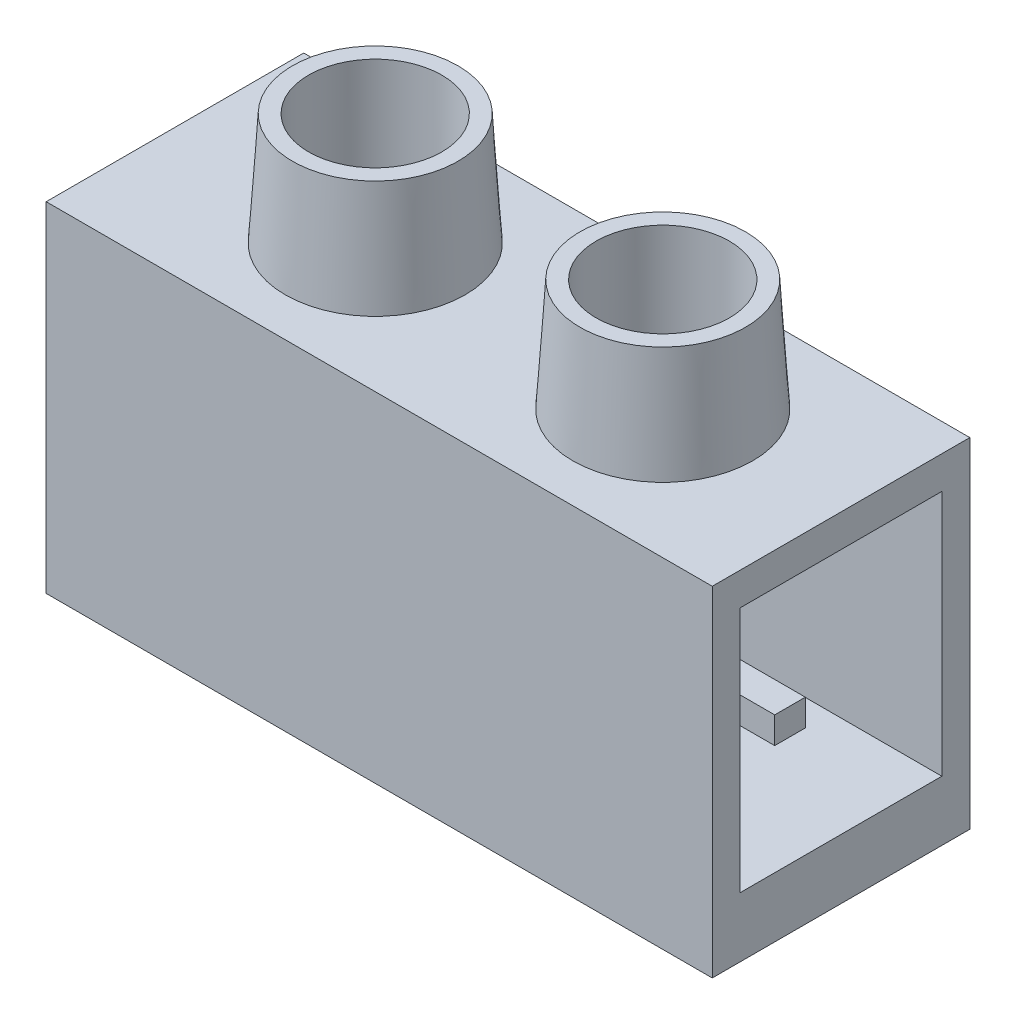
ISO-10303-21;
HEADER;
FILE_DESCRIPTION(('STEP AP214'),'2;1');
FILE_NAME('part.step','',(''),(''),'','','');
FILE_SCHEMA(('AUTOMOTIVE_DESIGN { 1 0 10303 214 1 1 1 1 }'));
ENDSEC;
DATA;
#1=APPLICATION_CONTEXT('core data for automotive mechanical design processes');
#2=APPLICATION_PROTOCOL_DEFINITION('international standard','automotive_design',2000,#1);
#3=PRODUCT_CONTEXT('',#1,'mechanical');
#4=PRODUCT('Part','Part','',(#3));
#5=PRODUCT_RELATED_PRODUCT_CATEGORY('part','',(#4));
#6=PRODUCT_DEFINITION_FORMATION('','',#4);
#7=PRODUCT_DEFINITION_CONTEXT('part definition',#1,'design');
#8=PRODUCT_DEFINITION('design','',#6,#7);
#9=PRODUCT_DEFINITION_SHAPE('','',#8);
#10=(LENGTH_UNIT() NAMED_UNIT(*) SI_UNIT(.MILLI.,.METRE.));
#11=(NAMED_UNIT(*) PLANE_ANGLE_UNIT() SI_UNIT($,.RADIAN.));
#12=(NAMED_UNIT(*) SI_UNIT($,.STERADIAN.) SOLID_ANGLE_UNIT());
#13=UNCERTAINTY_MEASURE_WITH_UNIT(LENGTH_MEASURE(1.E-05),#10,'distance_accuracy_value','');
#14=(GEOMETRIC_REPRESENTATION_CONTEXT(3) GLOBAL_UNCERTAINTY_ASSIGNED_CONTEXT((#13)) GLOBAL_UNIT_ASSIGNED_CONTEXT((#10,
#11,#12)) REPRESENTATION_CONTEXT('',''));
#15=CARTESIAN_POINT('',(0.,0.,0.));
#16=DIRECTION('',(0.,0.,1.));
#17=DIRECTION('',(1.,0.,0.));
#18=AXIS2_PLACEMENT_3D('',#15,#16,#17);
#19=CARTESIAN_POINT('',(-29.3484668170505,13.81,-4.54));
#20=DIRECTION('',(0.,1.,0.));
#21=DIRECTION('',(0.,0.,1.));
#22=AXIS2_PLACEMENT_3D('',#19,#20,#21);
#23=PLANE('',#22);
#24=DIRECTION('',(-1.,0.,0.));
#25=VECTOR('',#24,1.);
#26=CARTESIAN_POINT('',(10.0423301704278,13.81,2.97));
#27=LINE('',#26,#25);
#28=CARTESIAN_POINT('',(10.0423301704278,13.81,2.97));
#29=VERTEX_POINT('',#28);
#30=CARTESIAN_POINT('',(7.39320207938998,13.81,2.97));
#31=VERTEX_POINT('',#30);
#32=EDGE_CURVE('E265',#29,#31,#27,.T.);
#33=ORIENTED_EDGE('',*,*,#32,.T.);
#34=CARTESIAN_POINT('',(6.97,13.81,0.));
#35=DIRECTION('',(0.,1.,0.));
#36=DIRECTION('',(0.,0.,1.));
#37=AXIS2_PLACEMENT_3D('',#34,#35,#36);
#38=CIRCLE('',#37,3.);
#39=CARTESIAN_POINT('',(7.39320207938998,13.81,-2.97));
#40=VERTEX_POINT('',#39);
#41=EDGE_CURVE('E57',#40,#31,#38,.F.);
#42=ORIENTED_EDGE('',*,*,#41,.F.);
#43=DIRECTION('',(-1.,0.,0.));
#44=VECTOR('',#43,1.);
#45=CARTESIAN_POINT('',(10.0423301704278,13.81,-2.97));
#46=LINE('',#45,#44);
#47=CARTESIAN_POINT('',(10.0423301704278,13.81,-2.97));
#48=VERTEX_POINT('',#47);
#49=EDGE_CURVE('E351',#48,#40,#46,.T.);
#50=ORIENTED_EDGE('',*,*,#49,.F.);
#51=DIRECTION('',(0.,0.,-1.));
#52=VECTOR('',#51,1.);
#53=CARTESIAN_POINT('',(10.0423301704278,13.81,-4.54));
#54=LINE('',#53,#52);
#55=CARTESIAN_POINT('',(10.0423301704278,13.81,-4.54));
#56=VERTEX_POINT('',#55);
#57=EDGE_CURVE('E344',#48,#56,#54,.T.);
#58=ORIENTED_EDGE('',*,*,#57,.T.);
#59=DIRECTION('',(1.,0.,0.));
#60=VECTOR('',#59,1.);
#61=CARTESIAN_POINT('',(-29.3484668170505,13.81,-4.54));
#62=LINE('',#61,#60);
#63=CARTESIAN_POINT('',(15.,13.81,-4.54));
#64=VERTEX_POINT('',#63);
#65=EDGE_CURVE('E428',#56,#64,#62,.T.);
#66=ORIENTED_EDGE('',*,*,#65,.T.);
#67=DIRECTION('',(0.,0.,1.));
#68=VECTOR('',#67,1.);
#69=CARTESIAN_POINT('',(15.,13.81,-4.54));
#70=LINE('',#69,#68);
#71=CARTESIAN_POINT('',(15.,13.81,4.54));
#72=VERTEX_POINT('',#71);
#73=EDGE_CURVE('E423',#64,#72,#70,.T.);
#74=ORIENTED_EDGE('',*,*,#73,.T.);
#75=DIRECTION('',(1.,0.,0.));
#76=VECTOR('',#75,1.);
#77=CARTESIAN_POINT('',(-29.3484668170505,13.81,4.54));
#78=LINE('',#77,#76);
#79=CARTESIAN_POINT('',(10.0423301704278,13.81,4.54));
#80=VERTEX_POINT('',#79);
#81=EDGE_CURVE('E410',#80,#72,#78,.T.);
#82=ORIENTED_EDGE('',*,*,#81,.F.);
#83=DIRECTION('',(0.,0.,-1.));
#84=VECTOR('',#83,1.);
#85=CARTESIAN_POINT('',(10.0423301704278,13.81,4.54));
#86=LINE('',#85,#84);
#87=EDGE_CURVE('E293',#80,#29,#86,.T.);
#88=ORIENTED_EDGE('',*,*,#87,.T.);
#89=EDGE_LOOP('',(#33,#42,#50,#58,#66,#74,#82,#88));
#90=FACE_BOUND('',#89,.T.);
#91=ADVANCED_FACE('F33',(#90),#23,.F.);
#92=CARTESIAN_POINT('',(6.54679792061003,13.81,-2.97));
#93=VERTEX_POINT('',#92);
#94=CARTESIAN_POINT('',(-5.55679792061001,13.81,-2.97));
#95=VERTEX_POINT('',#94);
#96=EDGE_CURVE('E355',#93,#95,#46,.T.);
#97=ORIENTED_EDGE('',*,*,#96,.F.);
#98=CARTESIAN_POINT('',(6.54679792061003,13.81,2.97));
#99=VERTEX_POINT('',#98);
#100=EDGE_CURVE('E284',#99,#93,#38,.F.);
#101=ORIENTED_EDGE('',*,*,#100,.F.);
#102=CARTESIAN_POINT('',(-5.55679792061001,13.81,2.97));
#103=VERTEX_POINT('',#102);
#104=EDGE_CURVE('E241',#99,#103,#27,.T.);
#105=ORIENTED_EDGE('',*,*,#104,.T.);
#106=CARTESIAN_POINT('',(-5.98,13.81,0.));
#107=DIRECTION('',(0.,1.,0.));
#108=DIRECTION('',(0.,0.,1.));
#109=AXIS2_PLACEMENT_3D('',#106,#107,#108);
#110=CIRCLE('',#109,3.);
#111=EDGE_CURVE('E49',#95,#103,#110,.F.);
#112=ORIENTED_EDGE('',*,*,#111,.F.);
#113=EDGE_LOOP('',(#97,#101,#105,#112));
#114=FACE_BOUND('',#113,.T.);
#115=ADVANCED_FACE('F281',(#114),#23,.F.);
#116=CARTESIAN_POINT('',(10.0423301704278,10.81,0.75));
#117=DIRECTION('',(0.,0.,1.));
#118=DIRECTION('',(1.,0.,0.));
#119=AXIS2_PLACEMENT_3D('',#116,#117,#118);
#120=PLANE('',#119);
#121=DIRECTION('',(-1.,0.,0.));
#122=VECTOR('',#121,1.);
#123=CARTESIAN_POINT('',(10.0423301704278,10.81,0.75));
#124=LINE('',#123,#122);
#125=CARTESIAN_POINT('',(-9.67766982957222,10.81,0.75));
#126=VERTEX_POINT('',#125);
#127=CARTESIAN_POINT('',(-15.,10.81,0.75));
#128=VERTEX_POINT('',#127);
#129=EDGE_CURVE('E399',#126,#128,#124,.T.);
#130=ORIENTED_EDGE('',*,*,#129,.F.);
#131=DIRECTION('',(0.,-1.,0.));
#132=VECTOR('',#131,1.);
#133=CARTESIAN_POINT('',(-9.67766982957222,13.81,0.750000000000001));
#134=LINE('',#133,#132);
#135=CARTESIAN_POINT('',(-9.67766982957222,13.81,0.750000000000001));
#136=VERTEX_POINT('',#135);
#137=EDGE_CURVE('E682',#136,#126,#134,.T.);
#138=ORIENTED_EDGE('',*,*,#137,.F.);
#139=DIRECTION('',(-1.,0.,0.));
#140=VECTOR('',#139,1.);
#141=CARTESIAN_POINT('',(10.0423301704278,13.81,0.75));
#142=LINE('',#141,#140);
#143=CARTESIAN_POINT('',(-15.,13.81,0.750000000000001));
#144=VERTEX_POINT('',#143);
#145=EDGE_CURVE('E398',#136,#144,#142,.T.);
#146=ORIENTED_EDGE('',*,*,#145,.T.);
#147=DIRECTION('',(0.,1.,0.));
#148=VECTOR('',#147,1.);
#149=CARTESIAN_POINT('',(-15.,10.81,0.75));
#150=LINE('',#149,#148);
#151=EDGE_CURVE('E382',#128,#144,#150,.T.);
#152=ORIENTED_EDGE('',*,*,#151,.F.);
#153=EDGE_LOOP('',(#130,#138,#146,#152));
#154=FACE_BOUND('',#153,.T.);
#155=ADVANCED_FACE('F505',(#154),#120,.T.);
#156=CARTESIAN_POINT('',(10.0423301704278,10.81,-0.75));
#157=DIRECTION('',(0.,-1.,0.));
#158=DIRECTION('',(0.,0.,-1.));
#159=AXIS2_PLACEMENT_3D('',#156,#157,#158);
#160=PLANE('',#159);
#161=DIRECTION('',(-1.,0.,0.));
#162=VECTOR('',#161,1.);
#163=CARTESIAN_POINT('',(10.0423301704278,10.81,-0.75));
#164=LINE('',#163,#162);
#165=CARTESIAN_POINT('',(-9.67766982957222,10.81,-0.75));
#166=VERTEX_POINT('',#165);
#167=CARTESIAN_POINT('',(-15.,10.81,-0.75));
#168=VERTEX_POINT('',#167);
#169=EDGE_CURVE('E402',#166,#168,#164,.T.);
#170=ORIENTED_EDGE('',*,*,#169,.F.);
#171=DIRECTION('',(0.,0.,-1.));
#172=VECTOR('',#171,1.);
#173=CARTESIAN_POINT('',(-9.67766982957222,10.81,0.75));
#174=LINE('',#173,#172);
#175=EDGE_CURVE('E687',#126,#166,#174,.T.);
#176=ORIENTED_EDGE('',*,*,#175,.F.);
#177=ORIENTED_EDGE('',*,*,#129,.T.);
#178=DIRECTION('',(0.,0.,1.));
#179=VECTOR('',#178,1.);
#180=CARTESIAN_POINT('',(-15.,10.81,-0.75));
#181=LINE('',#180,#179);
#182=EDGE_CURVE('E395',#168,#128,#181,.T.);
#183=ORIENTED_EDGE('',*,*,#182,.F.);
#184=EDGE_LOOP('',(#170,#176,#177,#183));
#185=FACE_BOUND('',#184,.T.);
#186=ADVANCED_FACE('F669',(#185),#160,.T.);
#187=CARTESIAN_POINT('',(10.0423301704278,10.81,-0.75));
#188=DIRECTION('',(0.,0.,-1.));
#189=DIRECTION('',(-1.,0.,0.));
#190=AXIS2_PLACEMENT_3D('',#187,#188,#189);
#191=PLANE('',#190);
#192=DIRECTION('',(-1.,0.,0.));
#193=VECTOR('',#192,1.);
#194=CARTESIAN_POINT('',(10.0423301704278,13.81,-0.75));
#195=LINE('',#194,#193);
#196=CARTESIAN_POINT('',(-9.67766982957222,13.81,-0.75));
#197=VERTEX_POINT('',#196);
#198=CARTESIAN_POINT('',(-15.,13.81,-0.75));
#199=VERTEX_POINT('',#198);
#200=EDGE_CURVE('E404',#197,#199,#195,.T.);
#201=ORIENTED_EDGE('',*,*,#200,.F.);
#202=DIRECTION('',(0.,1.,0.));
#203=VECTOR('',#202,1.);
#204=CARTESIAN_POINT('',(-9.67766982957222,10.81,-0.75));
#205=LINE('',#204,#203);
#206=EDGE_CURVE('E302',#166,#197,#205,.T.);
#207=ORIENTED_EDGE('',*,*,#206,.F.);
#208=ORIENTED_EDGE('',*,*,#169,.T.);
#209=DIRECTION('',(0.,-1.,0.));
#210=VECTOR('',#209,1.);
#211=CARTESIAN_POINT('',(-15.,10.81,-0.75));
#212=LINE('',#211,#210);
#213=EDGE_CURVE('E392',#199,#168,#212,.T.);
#214=ORIENTED_EDGE('',*,*,#213,.F.);
#215=EDGE_LOOP('',(#201,#207,#208,#214));
#216=FACE_BOUND('',#215,.T.);
#217=ADVANCED_FACE('F498',(#216),#191,.T.);
#218=CARTESIAN_POINT('',(-15.,15.28,5.8));
#219=DIRECTION('',(1.,0.,0.));
#220=DIRECTION('',(0.,0.,-1.));
#221=AXIS2_PLACEMENT_3D('',#218,#219,#220);
#222=PLANE('',#221);
#223=DIRECTION('',(0.,0.,-1.));
#224=VECTOR('',#223,1.);
#225=CARTESIAN_POINT('',(-15.,13.81,-4.54));
#226=LINE('',#225,#224);
#227=CARTESIAN_POINT('',(-15.,13.81,2.97));
#228=VERTEX_POINT('',#227);
#229=EDGE_CURVE('E411',#228,#144,#226,.T.);
#230=ORIENTED_EDGE('',*,*,#229,.F.);
#231=DIRECTION('',(0.,-1.,0.));
#232=VECTOR('',#231,1.);
#233=CARTESIAN_POINT('',(-15.,13.81,2.97));
#234=LINE('',#233,#232);
#235=CARTESIAN_POINT('',(-15.,10.81,2.97));
#236=VERTEX_POINT('',#235);
#237=EDGE_CURVE('E263',#228,#236,#234,.T.);
#238=ORIENTED_EDGE('',*,*,#237,.T.);
#239=DIRECTION('',(0.,0.,1.));
#240=VECTOR('',#239,1.);
#241=CARTESIAN_POINT('',(-15.,10.81,4.54));
#242=LINE('',#241,#240);
#243=CARTESIAN_POINT('',(-15.,10.81,4.54));
#244=VERTEX_POINT('',#243);
#245=EDGE_CURVE('E297',#236,#244,#242,.T.);
#246=ORIENTED_EDGE('',*,*,#245,.T.);
#247=DIRECTION('',(0.,1.,0.));
#248=VECTOR('',#247,1.);
#249=CARTESIAN_POINT('',(-15.,2.7,4.54));
#250=LINE('',#249,#248);
#251=CARTESIAN_POINT('',(-15.,2.7,4.54));
#252=VERTEX_POINT('',#251);
#253=EDGE_CURVE('E413',#252,#244,#250,.T.);
#254=ORIENTED_EDGE('',*,*,#253,.F.);
#255=DIRECTION('',(0.,0.,1.));
#256=VECTOR('',#255,1.);
#257=CARTESIAN_POINT('',(-15.,2.7,-4.54));
#258=LINE('',#257,#256);
#259=CARTESIAN_POINT('',(-15.,2.7,3.35));
#260=VERTEX_POINT('',#259);
#261=EDGE_CURVE('E415',#260,#252,#258,.T.);
#262=ORIENTED_EDGE('',*,*,#261,.F.);
#263=DIRECTION('',(0.,1.,0.));
#264=VECTOR('',#263,1.);
#265=CARTESIAN_POINT('',(-15.,2.7,3.35));
#266=LINE('',#265,#264);
#267=CARTESIAN_POINT('',(-15.,3.9,3.35));
#268=VERTEX_POINT('',#267);
#269=EDGE_CURVE('E306',#260,#268,#266,.T.);
#270=ORIENTED_EDGE('',*,*,#269,.T.);
#271=DIRECTION('',(0.,0.,-1.));
#272=VECTOR('',#271,1.);
#273=CARTESIAN_POINT('',(-15.,3.9,3.35));
#274=LINE('',#273,#272);
#275=CARTESIAN_POINT('',(-15.,3.9,1.97));
#276=VERTEX_POINT('',#275);
#277=EDGE_CURVE('E310',#268,#276,#274,.T.);
#278=ORIENTED_EDGE('',*,*,#277,.T.);
#279=DIRECTION('',(0.,-1.,0.));
#280=VECTOR('',#279,1.);
#281=CARTESIAN_POINT('',(-15.,2.7,1.97));
#282=LINE('',#281,#280);
#283=CARTESIAN_POINT('',(-15.,2.7,1.97));
#284=VERTEX_POINT('',#283);
#285=EDGE_CURVE('E315',#276,#284,#282,.T.);
#286=ORIENTED_EDGE('',*,*,#285,.T.);
#287=CARTESIAN_POINT('',(-15.,2.7,-1.97));
#288=VERTEX_POINT('',#287);
#289=EDGE_CURVE('E437',#288,#284,#258,.T.);
#290=ORIENTED_EDGE('',*,*,#289,.F.);
#291=DIRECTION('',(0.,1.,0.));
#292=VECTOR('',#291,1.);
#293=CARTESIAN_POINT('',(-15.,2.7,-1.97));
#294=LINE('',#293,#292);
#295=CARTESIAN_POINT('',(-15.,3.9,-1.97));
#296=VERTEX_POINT('',#295);
#297=EDGE_CURVE('E375',#288,#296,#294,.T.);
#298=ORIENTED_EDGE('',*,*,#297,.T.);
#299=DIRECTION('',(0.,0.,-1.));
#300=VECTOR('',#299,1.);
#301=CARTESIAN_POINT('',(-15.,3.9,-3.35));
#302=LINE('',#301,#300);
#303=CARTESIAN_POINT('',(-15.,3.9,-3.35));
#304=VERTEX_POINT('',#303);
#305=EDGE_CURVE('E364',#296,#304,#302,.T.);
#306=ORIENTED_EDGE('',*,*,#305,.T.);
#307=DIRECTION('',(0.,-1.,0.));
#308=VECTOR('',#307,1.);
#309=CARTESIAN_POINT('',(-15.,2.7,-3.35));
#310=LINE('',#309,#308);
#311=CARTESIAN_POINT('',(-15.,2.7,-3.35));
#312=VERTEX_POINT('',#311);
#313=EDGE_CURVE('E354',#304,#312,#310,.T.);
#314=ORIENTED_EDGE('',*,*,#313,.T.);
#315=CARTESIAN_POINT('',(-15.,2.7,-4.54));
#316=VERTEX_POINT('',#315);
#317=EDGE_CURVE('E434',#316,#312,#258,.T.);
#318=ORIENTED_EDGE('',*,*,#317,.F.);
#319=DIRECTION('',(0.,-1.,0.));
#320=VECTOR('',#319,1.);
#321=CARTESIAN_POINT('',(-15.,2.7,-4.54));
#322=LINE('',#321,#320);
#323=CARTESIAN_POINT('',(-15.,10.81,-4.54));
#324=VERTEX_POINT('',#323);
#325=EDGE_CURVE('E407',#324,#316,#322,.T.);
#326=ORIENTED_EDGE('',*,*,#325,.F.);
#327=DIRECTION('',(0.,0.,1.));
#328=VECTOR('',#327,1.);
#329=CARTESIAN_POINT('',(-15.,10.81,-4.54));
#330=LINE('',#329,#328);
#331=CARTESIAN_POINT('',(-15.,10.81,-2.97));
#332=VERTEX_POINT('',#331);
#333=EDGE_CURVE('E327',#324,#332,#330,.T.);
#334=ORIENTED_EDGE('',*,*,#333,.T.);
#335=DIRECTION('',(0.,1.,0.));
#336=VECTOR('',#335,1.);
#337=CARTESIAN_POINT('',(-15.,13.81,-2.97));
#338=LINE('',#337,#336);
#339=CARTESIAN_POINT('',(-15.,13.81,-2.97));
#340=VERTEX_POINT('',#339);
#341=EDGE_CURVE('E338',#332,#340,#338,.T.);
#342=ORIENTED_EDGE('',*,*,#341,.T.);
#343=EDGE_CURVE('E409',#199,#340,#226,.T.);
#344=ORIENTED_EDGE('',*,*,#343,.F.);
#345=ORIENTED_EDGE('',*,*,#213,.T.);
#346=ORIENTED_EDGE('',*,*,#182,.T.);
#347=ORIENTED_EDGE('',*,*,#151,.T.);
#348=EDGE_LOOP('',(#230,#238,#246,#254,#262,#270,#278,#286,#290,#298,#306,#314,#318,#326,#334,
#342,#344,#345,#346,#347));
#349=FACE_BOUND('',#348,.T.);
#350=DIRECTION('',(0.,0.,1.));
#351=VECTOR('',#350,1.);
#352=CARTESIAN_POINT('',(-15.,0.,5.8));
#353=LINE('',#352,#351);
#354=CARTESIAN_POINT('',(-15.,0.,-5.8));
#355=VERTEX_POINT('',#354);
#356=CARTESIAN_POINT('',(-15.,0.,5.8));
#357=VERTEX_POINT('',#356);
#358=EDGE_CURVE('E443',#355,#357,#353,.T.);
#359=ORIENTED_EDGE('',*,*,#358,.T.);
#360=DIRECTION('',(0.,-1.,0.));
#361=VECTOR('',#360,1.);
#362=CARTESIAN_POINT('',(-15.,15.28,5.8));
#363=LINE('',#362,#361);
#364=CARTESIAN_POINT('',(-15.,15.28,5.8));
#365=VERTEX_POINT('',#364);
#366=EDGE_CURVE('E11',#365,#357,#363,.T.);
#367=ORIENTED_EDGE('',*,*,#366,.F.);
#368=DIRECTION('',(0.,0.,1.));
#369=VECTOR('',#368,1.);
#370=CARTESIAN_POINT('',(-15.,15.28,5.8));
#371=LINE('',#370,#369);
#372=CARTESIAN_POINT('',(-15.,15.28,-5.8));
#373=VERTEX_POINT('',#372);
#374=EDGE_CURVE('E444',#373,#365,#371,.T.);
#375=ORIENTED_EDGE('',*,*,#374,.F.);
#376=DIRECTION('',(0.,-1.,0.));
#377=VECTOR('',#376,1.);
#378=CARTESIAN_POINT('',(-15.,15.28,-5.8));
#379=LINE('',#378,#377);
#380=EDGE_CURVE('E454',#373,#355,#379,.T.);
#381=ORIENTED_EDGE('',*,*,#380,.T.);
#382=EDGE_LOOP('',(#359,#367,#375,#381));
#383=FACE_BOUND('',#382,.T.);
#384=ADVANCED_FACE('F485',(#349,#383),#222,.F.);
#385=CARTESIAN_POINT('',(15.,15.28,5.8));
#386=DIRECTION('',(0.,0.,-1.));
#387=DIRECTION('',(-1.,0.,0.));
#388=AXIS2_PLACEMENT_3D('',#385,#386,#387);
#389=PLANE('',#388);
#390=DIRECTION('',(1.,0.,0.));
#391=VECTOR('',#390,1.);
#392=CARTESIAN_POINT('',(15.,0.,5.8));
#393=LINE('',#392,#391);
#394=CARTESIAN_POINT('',(15.,0.,5.8));
#395=VERTEX_POINT('',#394);
#396=EDGE_CURVE('E457',#357,#395,#393,.T.);
#397=ORIENTED_EDGE('',*,*,#396,.T.);
#398=DIRECTION('',(0.,-1.,0.));
#399=VECTOR('',#398,1.);
#400=CARTESIAN_POINT('',(15.,15.28,5.8));
#401=LINE('',#400,#399);
#402=CARTESIAN_POINT('',(15.,15.28,5.8));
#403=VERTEX_POINT('',#402);
#404=EDGE_CURVE('E42',#403,#395,#401,.T.);
#405=ORIENTED_EDGE('',*,*,#404,.F.);
#406=DIRECTION('',(1.,0.,0.));
#407=VECTOR('',#406,1.);
#408=CARTESIAN_POINT('',(15.,15.28,5.8));
#409=LINE('',#408,#407);
#410=EDGE_CURVE('E447',#365,#403,#409,.T.);
#411=ORIENTED_EDGE('',*,*,#410,.F.);
#412=ORIENTED_EDGE('',*,*,#366,.T.);
#413=EDGE_LOOP('',(#397,#405,#411,#412));
#414=FACE_BOUND('',#413,.T.);
#415=ADVANCED_FACE('F489',(#414),#389,.F.);
#416=CARTESIAN_POINT('',(15.,15.28,5.8));
#417=DIRECTION('',(-1.,0.,0.));
#418=DIRECTION('',(0.,0.,1.));
#419=AXIS2_PLACEMENT_3D('',#416,#417,#418);
#420=PLANE('',#419);
#421=DIRECTION('',(0.,0.,-1.));
#422=VECTOR('',#421,1.);
#423=CARTESIAN_POINT('',(15.,2.7,-4.54));
#424=LINE('',#423,#422);
#425=CARTESIAN_POINT('',(15.,2.7,4.54));
#426=VERTEX_POINT('',#425);
#427=CARTESIAN_POINT('',(15.,2.7,-4.54));
#428=VERTEX_POINT('',#427);
#429=EDGE_CURVE('E417',#426,#428,#424,.T.);
#430=ORIENTED_EDGE('',*,*,#429,.F.);
#431=DIRECTION('',(0.,-1.,0.));
#432=VECTOR('',#431,1.);
#433=CARTESIAN_POINT('',(15.,2.7,4.54));
#434=LINE('',#433,#432);
#435=EDGE_CURVE('E401',#72,#426,#434,.T.);
#436=ORIENTED_EDGE('',*,*,#435,.F.);
#437=ORIENTED_EDGE('',*,*,#73,.F.);
#438=DIRECTION('',(0.,1.,0.));
#439=VECTOR('',#438,1.);
#440=CARTESIAN_POINT('',(15.,2.7,-4.54));
#441=LINE('',#440,#439);
#442=EDGE_CURVE('E420',#428,#64,#441,.T.);
#443=ORIENTED_EDGE('',*,*,#442,.F.);
#444=EDGE_LOOP('',(#430,#436,#437,#443));
#445=FACE_BOUND('',#444,.T.);
#446=DIRECTION('',(0.,0.,-1.));
#447=VECTOR('',#446,1.);
#448=CARTESIAN_POINT('',(15.,0.,5.8));
#449=LINE('',#448,#447);
#450=CARTESIAN_POINT('',(15.,0.,-5.8));
#451=VERTEX_POINT('',#450);
#452=EDGE_CURVE('E459',#395,#451,#449,.T.);
#453=ORIENTED_EDGE('',*,*,#452,.T.);
#454=DIRECTION('',(0.,-1.,0.));
#455=VECTOR('',#454,1.);
#456=CARTESIAN_POINT('',(15.,15.28,-5.8));
#457=LINE('',#456,#455);
#458=CARTESIAN_POINT('',(15.,15.28,-5.8));
#459=VERTEX_POINT('',#458);
#460=EDGE_CURVE('E465',#459,#451,#457,.T.);
#461=ORIENTED_EDGE('',*,*,#460,.F.);
#462=DIRECTION('',(0.,0.,-1.));
#463=VECTOR('',#462,1.);
#464=CARTESIAN_POINT('',(15.,15.28,5.8));
#465=LINE('',#464,#463);
#466=EDGE_CURVE('E450',#403,#459,#465,.T.);
#467=ORIENTED_EDGE('',*,*,#466,.F.);
#468=ORIENTED_EDGE('',*,*,#404,.T.);
#469=EDGE_LOOP('',(#453,#461,#467,#468));
#470=FACE_BOUND('',#469,.T.);
#471=ADVANCED_FACE('F473',(#445,#470),#420,.F.);
#472=CARTESIAN_POINT('',(-3.25,15.28,-5.8));
#473=DIRECTION('',(0.,0.,1.));
#474=DIRECTION('',(1.,0.,0.));
#475=AXIS2_PLACEMENT_3D('',#472,#473,#474);
#476=PLANE('',#475);
#477=DIRECTION('',(-1.,0.,0.));
#478=VECTOR('',#477,1.);
#479=CARTESIAN_POINT('',(-3.25,0.,-5.8));
#480=LINE('',#479,#478);
#481=EDGE_CURVE('E448',#451,#355,#480,.T.);
#482=ORIENTED_EDGE('',*,*,#481,.T.);
#483=ORIENTED_EDGE('',*,*,#380,.F.);
#484=DIRECTION('',(-1.,0.,0.));
#485=VECTOR('',#484,1.);
#486=CARTESIAN_POINT('',(15.,15.28,-5.8));
#487=LINE('',#486,#485);
#488=EDGE_CURVE('E452',#459,#373,#487,.T.);
#489=ORIENTED_EDGE('',*,*,#488,.F.);
#490=ORIENTED_EDGE('',*,*,#460,.T.);
#491=EDGE_LOOP('',(#482,#483,#489,#490));
#492=FACE_BOUND('',#491,.T.);
#493=ADVANCED_FACE('F481',(#492),#476,.F.);
#494=CARTESIAN_POINT('',(0.,15.28,0.));
#495=DIRECTION('',(0.,1.,0.));
#496=DIRECTION('',(0.,0.,1.));
#497=AXIS2_PLACEMENT_3D('',#494,#495,#496);
#498=PLANE('',#497);
#499=CARTESIAN_POINT('',(6.97,15.28,0.));
#500=DIRECTION('',(0.,1.,0.));
#501=DIRECTION('',(0.,0.,1.));
#502=AXIS2_PLACEMENT_3D('',#499,#500,#501);
#503=CIRCLE('',#502,4.05);
#504=CARTESIAN_POINT('',(6.97,15.28,4.05));
#505=VERTEX_POINT('',#504);
#506=EDGE_CURVE('E436',#505,#505,#503,.T.);
#507=ORIENTED_EDGE('',*,*,#506,.F.);
#508=EDGE_LOOP('',(#507));
#509=FACE_BOUND('',#508,.T.);
#510=CARTESIAN_POINT('',(-5.98,15.28,0.));
#511=DIRECTION('',(0.,1.,0.));
#512=DIRECTION('',(0.,0.,1.));
#513=AXIS2_PLACEMENT_3D('',#510,#511,#512);
#514=CIRCLE('',#513,4.05);
#515=CARTESIAN_POINT('',(-5.98,15.28,4.05));
#516=VERTEX_POINT('',#515);
#517=EDGE_CURVE('E440',#516,#516,#514,.T.);
#518=ORIENTED_EDGE('',*,*,#517,.F.);
#519=EDGE_LOOP('',(#518));
#520=FACE_BOUND('',#519,.T.);
#521=ORIENTED_EDGE('',*,*,#374,.T.);
#522=ORIENTED_EDGE('',*,*,#410,.T.);
#523=ORIENTED_EDGE('',*,*,#466,.T.);
#524=ORIENTED_EDGE('',*,*,#488,.T.);
#525=EDGE_LOOP('',(#521,#522,#523,#524));
#526=FACE_BOUND('',#525,.T.);
#527=ADVANCED_FACE('F488',(#509,#520,#526),#498,.T.);
#528=CARTESIAN_POINT('',(0.,0.,0.));
#529=DIRECTION('',(0.,1.,0.));
#530=DIRECTION('',(0.,0.,1.));
#531=AXIS2_PLACEMENT_3D('',#528,#529,#530);
#532=PLANE('',#531);
#533=ORIENTED_EDGE('',*,*,#358,.F.);
#534=ORIENTED_EDGE('',*,*,#481,.F.);
#535=ORIENTED_EDGE('',*,*,#452,.F.);
#536=ORIENTED_EDGE('',*,*,#396,.F.);
#537=EDGE_LOOP('',(#533,#534,#535,#536));
#538=FACE_BOUND('',#537,.T.);
#539=ADVANCED_FACE('F478',(#538),#532,.F.);
#540=CARTESIAN_POINT('',(-5.98,25.,0.));
#541=DIRECTION('',(0.,-1.,0.));
#542=DIRECTION('',(0.,0.,-1.));
#543=AXIS2_PLACEMENT_3D('',#540,#541,#542);
#544=CONICAL_SURFACE('',#543,3.43000000000001,0.0636997110502609);
#545=CARTESIAN_POINT('',(-5.98,20.33,0.));
#546=DIRECTION('',(0.,-1.,0.));
#547=DIRECTION('',(0.,0.,-1.));
#548=AXIS2_PLACEMENT_3D('',#545,#546,#547);
#549=CIRCLE('',#548,3.72788065843621);
#550=CARTESIAN_POINT('',(-5.98,20.33,-3.72788065843621));
#551=VERTEX_POINT('',#550);
#552=EDGE_CURVE('E249',#551,#551,#549,.F.);
#553=ORIENTED_EDGE('',*,*,#552,.F.);
#554=EDGE_LOOP('',(#553));
#555=FACE_BOUND('',#554,.T.);
#556=ORIENTED_EDGE('',*,*,#517,.T.);
#557=EDGE_LOOP('',(#556));
#558=FACE_BOUND('',#557,.T.);
#559=ADVANCED_FACE('F522',(#555,#558),#544,.T.);
#560=CARTESIAN_POINT('',(6.97,25.,0.));
#561=DIRECTION('',(0.,-1.,0.));
#562=DIRECTION('',(0.,0.,-1.));
#563=AXIS2_PLACEMENT_3D('',#560,#561,#562);
#564=CONICAL_SURFACE('',#563,3.43000000000001,0.0636997110502609);
#565=CARTESIAN_POINT('',(6.97,20.33,0.));
#566=DIRECTION('',(0.,-1.,0.));
#567=DIRECTION('',(0.,0.,-1.));
#568=AXIS2_PLACEMENT_3D('',#565,#566,#567);
#569=CIRCLE('',#568,3.72788065843621);
#570=CARTESIAN_POINT('',(6.97,20.33,-3.72788065843621));
#571=VERTEX_POINT('',#570);
#572=EDGE_CURVE('E703',#571,#571,#569,.F.);
#573=ORIENTED_EDGE('',*,*,#572,.F.);
#574=EDGE_LOOP('',(#573));
#575=FACE_BOUND('',#574,.T.);
#576=ORIENTED_EDGE('',*,*,#506,.T.);
#577=EDGE_LOOP('',(#576));
#578=FACE_BOUND('',#577,.T.);
#579=ADVANCED_FACE('F35',(#575,#578),#564,.T.);
#580=CARTESIAN_POINT('',(-29.3484668170505,2.7,4.54));
#581=DIRECTION('',(0.,0.,1.));
#582=DIRECTION('',(0.,-1.,0.));
#583=AXIS2_PLACEMENT_3D('',#580,#581,#582);
#584=PLANE('',#583);
#585=ORIENTED_EDGE('',*,*,#253,.T.);
#586=DIRECTION('',(-1.,0.,0.));
#587=VECTOR('',#586,1.);
#588=CARTESIAN_POINT('',(10.0423301704278,10.81,4.54));
#589=LINE('',#588,#587);
#590=CARTESIAN_POINT('',(10.0423301704278,10.81,4.54));
#591=VERTEX_POINT('',#590);
#592=EDGE_CURVE('E275',#591,#244,#589,.T.);
#593=ORIENTED_EDGE('',*,*,#592,.F.);
#594=DIRECTION('',(0.,1.,0.));
#595=VECTOR('',#594,1.);
#596=CARTESIAN_POINT('',(10.0423301704278,13.81,4.54));
#597=LINE('',#596,#595);
#598=EDGE_CURVE('E264',#591,#80,#597,.T.);
#599=ORIENTED_EDGE('',*,*,#598,.T.);
#600=ORIENTED_EDGE('',*,*,#81,.T.);
#601=ORIENTED_EDGE('',*,*,#435,.T.);
#602=DIRECTION('',(1.,0.,0.));
#603=VECTOR('',#602,1.);
#604=CARTESIAN_POINT('',(-29.3484668170505,2.7,4.54));
#605=LINE('',#604,#603);
#606=EDGE_CURVE('E426',#252,#426,#605,.T.);
#607=ORIENTED_EDGE('',*,*,#606,.F.);
#608=EDGE_LOOP('',(#585,#593,#599,#600,#601,#607));
#609=FACE_BOUND('',#608,.T.);
#610=ADVANCED_FACE('F510',(#609),#584,.F.);
#611=CARTESIAN_POINT('',(-6.40320207938998,13.81,-2.97));
#612=VERTEX_POINT('',#611);
#613=EDGE_CURVE('E256',#612,#340,#46,.T.);
#614=ORIENTED_EDGE('',*,*,#613,.F.);
#615=CARTESIAN_POINT('',(-6.40320207938998,13.81,2.97));
#616=VERTEX_POINT('',#615);
#617=EDGE_CURVE('E247',#616,#612,#110,.F.);
#618=ORIENTED_EDGE('',*,*,#617,.F.);
#619=EDGE_CURVE('E242',#616,#228,#27,.T.);
#620=ORIENTED_EDGE('',*,*,#619,.T.);
#621=ORIENTED_EDGE('',*,*,#229,.T.);
#622=ORIENTED_EDGE('',*,*,#145,.F.);
#623=DIRECTION('',(0.,0.,1.));
#624=VECTOR('',#623,1.);
#625=CARTESIAN_POINT('',(-9.67766982957222,13.81,-0.75));
#626=LINE('',#625,#624);
#627=EDGE_CURVE('E691',#197,#136,#626,.T.);
#628=ORIENTED_EDGE('',*,*,#627,.F.);
#629=ORIENTED_EDGE('',*,*,#200,.T.);
#630=ORIENTED_EDGE('',*,*,#343,.T.);
#631=EDGE_LOOP('',(#614,#618,#620,#621,#622,#628,#629,#630));
#632=FACE_BOUND('',#631,.T.);
#633=ADVANCED_FACE('F252',(#632),#23,.F.);
#634=CARTESIAN_POINT('',(-29.3484668170505,2.7,-4.54));
#635=DIRECTION('',(0.,0.,-1.));
#636=DIRECTION('',(0.,1.,0.));
#637=AXIS2_PLACEMENT_3D('',#634,#635,#636);
#638=PLANE('',#637);
#639=DIRECTION('',(0.,-1.,0.));
#640=VECTOR('',#639,1.);
#641=CARTESIAN_POINT('',(10.0423301704278,13.81,-4.54));
#642=LINE('',#641,#640);
#643=CARTESIAN_POINT('',(10.0423301704278,10.81,-4.54));
#644=VERTEX_POINT('',#643);
#645=EDGE_CURVE('E335',#56,#644,#642,.T.);
#646=ORIENTED_EDGE('',*,*,#645,.T.);
#647=DIRECTION('',(-1.,0.,0.));
#648=VECTOR('',#647,1.);
#649=CARTESIAN_POINT('',(10.0423301704278,10.81,-4.54));
#650=LINE('',#649,#648);
#651=EDGE_CURVE('E346',#644,#324,#650,.T.);
#652=ORIENTED_EDGE('',*,*,#651,.T.);
#653=ORIENTED_EDGE('',*,*,#325,.T.);
#654=DIRECTION('',(1.,0.,0.));
#655=VECTOR('',#654,1.);
#656=CARTESIAN_POINT('',(-29.3484668170505,2.7,-4.54));
#657=LINE('',#656,#655);
#658=EDGE_CURVE('E430',#316,#428,#657,.T.);
#659=ORIENTED_EDGE('',*,*,#658,.T.);
#660=ORIENTED_EDGE('',*,*,#442,.T.);
#661=ORIENTED_EDGE('',*,*,#65,.F.);
#662=EDGE_LOOP('',(#646,#652,#653,#659,#660,#661));
#663=FACE_BOUND('',#662,.T.);
#664=ADVANCED_FACE('F509',(#663),#638,.F.);
#665=CARTESIAN_POINT('',(-29.3484668170505,2.7,-4.54));
#666=DIRECTION('',(0.,-1.,0.));
#667=DIRECTION('',(0.,0.,-1.));
#668=AXIS2_PLACEMENT_3D('',#665,#666,#667);
#669=PLANE('',#668);
#670=ORIENTED_EDGE('',*,*,#289,.T.);
#671=DIRECTION('',(-1.,0.,0.));
#672=VECTOR('',#671,1.);
#673=CARTESIAN_POINT('',(10.0423301704278,2.7,1.97));
#674=LINE('',#673,#672);
#675=CARTESIAN_POINT('',(10.0423301704278,2.7,1.97));
#676=VERTEX_POINT('',#675);
#677=EDGE_CURVE('E324',#676,#284,#674,.T.);
#678=ORIENTED_EDGE('',*,*,#677,.F.);
#679=DIRECTION('',(0.,0.,1.));
#680=VECTOR('',#679,1.);
#681=CARTESIAN_POINT('',(10.0423301704278,2.7,3.35));
#682=LINE('',#681,#680);
#683=CARTESIAN_POINT('',(10.0423301704278,2.7,3.35));
#684=VERTEX_POINT('',#683);
#685=EDGE_CURVE('E323',#676,#684,#682,.T.);
#686=ORIENTED_EDGE('',*,*,#685,.T.);
#687=DIRECTION('',(-1.,0.,0.));
#688=VECTOR('',#687,1.);
#689=CARTESIAN_POINT('',(10.0423301704278,2.7,3.35));
#690=LINE('',#689,#688);
#691=EDGE_CURVE('E332',#684,#260,#690,.T.);
#692=ORIENTED_EDGE('',*,*,#691,.T.);
#693=ORIENTED_EDGE('',*,*,#261,.T.);
#694=ORIENTED_EDGE('',*,*,#606,.T.);
#695=ORIENTED_EDGE('',*,*,#429,.T.);
#696=ORIENTED_EDGE('',*,*,#658,.F.);
#697=ORIENTED_EDGE('',*,*,#317,.T.);
#698=DIRECTION('',(-1.,0.,0.));
#699=VECTOR('',#698,1.);
#700=CARTESIAN_POINT('',(10.0423301704278,2.7,-3.35));
#701=LINE('',#700,#699);
#702=CARTESIAN_POINT('',(10.0423301704278,2.7,-3.35));
#703=VERTEX_POINT('',#702);
#704=EDGE_CURVE('E372',#703,#312,#701,.T.);
#705=ORIENTED_EDGE('',*,*,#704,.F.);
#706=DIRECTION('',(0.,0.,1.));
#707=VECTOR('',#706,1.);
#708=CARTESIAN_POINT('',(10.0423301704278,2.7,-3.35));
#709=LINE('',#708,#707);
#710=CARTESIAN_POINT('',(10.0423301704278,2.7,-1.97));
#711=VERTEX_POINT('',#710);
#712=EDGE_CURVE('E363',#703,#711,#709,.T.);
#713=ORIENTED_EDGE('',*,*,#712,.T.);
#714=DIRECTION('',(-1.,0.,0.));
#715=VECTOR('',#714,1.);
#716=CARTESIAN_POINT('',(10.0423301704278,2.7,-1.97));
#717=LINE('',#716,#715);
#718=EDGE_CURVE('E385',#711,#288,#717,.T.);
#719=ORIENTED_EDGE('',*,*,#718,.T.);
#720=EDGE_LOOP('',(#670,#678,#686,#692,#693,#694,#695,#696,#697,#705,#713,#719));
#721=FACE_BOUND('',#720,.T.);
#722=ADVANCED_FACE('F515',(#721),#669,.F.);
#723=CARTESIAN_POINT('',(10.0423301704278,2.7,-3.35));
#724=DIRECTION('',(0.,0.,-1.));
#725=DIRECTION('',(-1.,0.,0.));
#726=AXIS2_PLACEMENT_3D('',#723,#724,#725);
#727=PLANE('',#726);
#728=ORIENTED_EDGE('',*,*,#313,.F.);
#729=DIRECTION('',(-1.,0.,0.));
#730=VECTOR('',#729,1.);
#731=CARTESIAN_POINT('',(10.0423301704278,3.9,-3.35));
#732=LINE('',#731,#730);
#733=CARTESIAN_POINT('',(10.0423301704278,3.9,-3.35));
#734=VERTEX_POINT('',#733);
#735=EDGE_CURVE('E380',#734,#304,#732,.T.);
#736=ORIENTED_EDGE('',*,*,#735,.F.);
#737=DIRECTION('',(0.,-1.,0.));
#738=VECTOR('',#737,1.);
#739=CARTESIAN_POINT('',(10.0423301704278,2.7,-3.35));
#740=LINE('',#739,#738);
#741=EDGE_CURVE('E360',#734,#703,#740,.T.);
#742=ORIENTED_EDGE('',*,*,#741,.T.);
#743=ORIENTED_EDGE('',*,*,#704,.T.);
#744=EDGE_LOOP('',(#728,#736,#742,#743));
#745=FACE_BOUND('',#744,.T.);
#746=ADVANCED_FACE('F661',(#745),#727,.T.);
#747=CARTESIAN_POINT('',(10.0423301704278,3.9,-3.35));
#748=DIRECTION('',(0.,1.,0.));
#749=DIRECTION('',(0.,0.,1.));
#750=AXIS2_PLACEMENT_3D('',#747,#748,#749);
#751=PLANE('',#750);
#752=ORIENTED_EDGE('',*,*,#305,.F.);
#753=DIRECTION('',(-1.,0.,0.));
#754=VECTOR('',#753,1.);
#755=CARTESIAN_POINT('',(10.0423301704278,3.9,-1.97));
#756=LINE('',#755,#754);
#757=CARTESIAN_POINT('',(10.0423301704278,3.9,-1.97));
#758=VERTEX_POINT('',#757);
#759=EDGE_CURVE('E383',#758,#296,#756,.T.);
#760=ORIENTED_EDGE('',*,*,#759,.F.);
#761=DIRECTION('',(0.,0.,-1.));
#762=VECTOR('',#761,1.);
#763=CARTESIAN_POINT('',(10.0423301704278,3.9,-3.35));
#764=LINE('',#763,#762);
#765=EDGE_CURVE('E369',#758,#734,#764,.T.);
#766=ORIENTED_EDGE('',*,*,#765,.T.);
#767=ORIENTED_EDGE('',*,*,#735,.T.);
#768=EDGE_LOOP('',(#752,#760,#766,#767));
#769=FACE_BOUND('',#768,.T.);
#770=ADVANCED_FACE('F658',(#769),#751,.T.);
#771=CARTESIAN_POINT('',(10.0423301704278,2.7,-1.97));
#772=DIRECTION('',(0.,0.,1.));
#773=DIRECTION('',(1.,0.,0.));
#774=AXIS2_PLACEMENT_3D('',#771,#772,#773);
#775=PLANE('',#774);
#776=ORIENTED_EDGE('',*,*,#297,.F.);
#777=ORIENTED_EDGE('',*,*,#718,.F.);
#778=DIRECTION('',(0.,1.,0.));
#779=VECTOR('',#778,1.);
#780=CARTESIAN_POINT('',(10.0423301704278,2.7,-1.97));
#781=LINE('',#780,#779);
#782=EDGE_CURVE('E366',#711,#758,#781,.T.);
#783=ORIENTED_EDGE('',*,*,#782,.T.);
#784=ORIENTED_EDGE('',*,*,#759,.T.);
#785=EDGE_LOOP('',(#776,#777,#783,#784));
#786=FACE_BOUND('',#785,.T.);
#787=ADVANCED_FACE('F656',(#786),#775,.T.);
#788=CARTESIAN_POINT('',(10.0423301704278,0.,0.));
#789=DIRECTION('',(1.,0.,0.));
#790=DIRECTION('',(0.,0.,-1.));
#791=AXIS2_PLACEMENT_3D('',#788,#789,#790);
#792=PLANE('',#791);
#793=ORIENTED_EDGE('',*,*,#741,.F.);
#794=ORIENTED_EDGE('',*,*,#765,.F.);
#795=ORIENTED_EDGE('',*,*,#782,.F.);
#796=ORIENTED_EDGE('',*,*,#712,.F.);
#797=EDGE_LOOP('',(#793,#794,#795,#796));
#798=FACE_BOUND('',#797,.T.);
#799=ADVANCED_FACE('F649',(#798),#792,.T.);
#800=CARTESIAN_POINT('',(10.0423301704278,13.81,-2.97));
#801=DIRECTION('',(0.,0.,1.));
#802=DIRECTION('',(0.,-1.,0.));
#803=AXIS2_PLACEMENT_3D('',#800,#801,#802);
#804=PLANE('',#803);
#805=ORIENTED_EDGE('',*,*,#341,.F.);
#806=DIRECTION('',(-1.,0.,0.));
#807=VECTOR('',#806,1.);
#808=CARTESIAN_POINT('',(10.0423301704278,10.81,-2.97));
#809=LINE('',#808,#807);
#810=CARTESIAN_POINT('',(10.0423301704278,10.81,-2.97));
#811=VERTEX_POINT('',#810);
#812=EDGE_CURVE('E356',#811,#332,#809,.T.);
#813=ORIENTED_EDGE('',*,*,#812,.F.);
#814=DIRECTION('',(0.,1.,0.));
#815=VECTOR('',#814,1.);
#816=CARTESIAN_POINT('',(10.0423301704278,13.81,-2.97));
#817=LINE('',#816,#815);
#818=EDGE_CURVE('E341',#811,#48,#817,.T.);
#819=ORIENTED_EDGE('',*,*,#818,.T.);
#820=ORIENTED_EDGE('',*,*,#49,.T.);
#821=DIRECTION('',(-1.,0.,0.));
#822=VECTOR('',#821,1.);
#823=CARTESIAN_POINT('',(10.0423301704278,13.81,-2.97));
#824=LINE('',#823,#822);
#825=EDGE_CURVE('E695',#40,#93,#824,.T.);
#826=ORIENTED_EDGE('',*,*,#825,.T.);
#827=ORIENTED_EDGE('',*,*,#96,.T.);
#828=DIRECTION('',(-1.,0.,0.));
#829=VECTOR('',#828,1.);
#830=CARTESIAN_POINT('',(10.0423301704278,13.81,-2.97));
#831=LINE('',#830,#829);
#832=EDGE_CURVE('E698',#95,#612,#831,.T.);
#833=ORIENTED_EDGE('',*,*,#832,.T.);
#834=ORIENTED_EDGE('',*,*,#613,.T.);
#835=EDGE_LOOP('',(#805,#813,#819,#820,#826,#827,#833,#834));
#836=FACE_BOUND('',#835,.T.);
#837=ADVANCED_FACE('F646',(#836),#804,.T.);
#838=CARTESIAN_POINT('',(10.0423301704278,10.81,-4.54));
#839=DIRECTION('',(0.,-1.,0.));
#840=DIRECTION('',(0.,0.,-1.));
#841=AXIS2_PLACEMENT_3D('',#838,#839,#840);
#842=PLANE('',#841);
#843=ORIENTED_EDGE('',*,*,#333,.F.);
#844=ORIENTED_EDGE('',*,*,#651,.F.);
#845=DIRECTION('',(0.,0.,1.));
#846=VECTOR('',#845,1.);
#847=CARTESIAN_POINT('',(10.0423301704278,10.81,-4.54));
#848=LINE('',#847,#846);
#849=EDGE_CURVE('E337',#644,#811,#848,.T.);
#850=ORIENTED_EDGE('',*,*,#849,.T.);
#851=ORIENTED_EDGE('',*,*,#812,.T.);
#852=EDGE_LOOP('',(#843,#844,#850,#851));
#853=FACE_BOUND('',#852,.T.);
#854=ADVANCED_FACE('F644',(#853),#842,.T.);
#855=CARTESIAN_POINT('',(10.0423301704278,0.,0.));
#856=DIRECTION('',(-1.,0.,0.));
#857=DIRECTION('',(0.,0.,1.));
#858=AXIS2_PLACEMENT_3D('',#855,#856,#857);
#859=PLANE('',#858);
#860=ORIENTED_EDGE('',*,*,#645,.F.);
#861=ORIENTED_EDGE('',*,*,#57,.F.);
#862=ORIENTED_EDGE('',*,*,#818,.F.);
#863=ORIENTED_EDGE('',*,*,#849,.F.);
#864=EDGE_LOOP('',(#860,#861,#862,#863));
#865=FACE_BOUND('',#864,.T.);
#866=ADVANCED_FACE('F634',(#865),#859,.F.);
#867=CARTESIAN_POINT('',(10.0423301704278,2.7,1.97));
#868=DIRECTION('',(0.,0.,-1.));
#869=DIRECTION('',(-1.,0.,0.));
#870=AXIS2_PLACEMENT_3D('',#867,#868,#869);
#871=PLANE('',#870);
#872=ORIENTED_EDGE('',*,*,#285,.F.);
#873=DIRECTION('',(-1.,0.,0.));
#874=VECTOR('',#873,1.);
#875=CARTESIAN_POINT('',(10.0423301704278,3.9,1.97));
#876=LINE('',#875,#874);
#877=CARTESIAN_POINT('',(10.0423301704278,3.9,1.97));
#878=VERTEX_POINT('',#877);
#879=EDGE_CURVE('E328',#878,#276,#876,.T.);
#880=ORIENTED_EDGE('',*,*,#879,.F.);
#881=DIRECTION('',(0.,-1.,0.));
#882=VECTOR('',#881,1.);
#883=CARTESIAN_POINT('',(10.0423301704278,2.7,1.97));
#884=LINE('',#883,#882);
#885=EDGE_CURVE('E318',#878,#676,#884,.T.);
#886=ORIENTED_EDGE('',*,*,#885,.T.);
#887=ORIENTED_EDGE('',*,*,#677,.T.);
#888=EDGE_LOOP('',(#872,#880,#886,#887));
#889=FACE_BOUND('',#888,.T.);
#890=ADVANCED_FACE('F630',(#889),#871,.T.);
#891=CARTESIAN_POINT('',(10.0423301704278,3.9,3.35));
#892=DIRECTION('',(0.,1.,0.));
#893=DIRECTION('',(0.,0.,1.));
#894=AXIS2_PLACEMENT_3D('',#891,#892,#893);
#895=PLANE('',#894);
#896=ORIENTED_EDGE('',*,*,#277,.F.);
#897=DIRECTION('',(-1.,0.,0.));
#898=VECTOR('',#897,1.);
#899=CARTESIAN_POINT('',(10.0423301704278,3.9,3.35));
#900=LINE('',#899,#898);
#901=CARTESIAN_POINT('',(10.0423301704278,3.9,3.35));
#902=VERTEX_POINT('',#901);
#903=EDGE_CURVE('E330',#902,#268,#900,.T.);
#904=ORIENTED_EDGE('',*,*,#903,.F.);
#905=DIRECTION('',(0.,0.,-1.));
#906=VECTOR('',#905,1.);
#907=CARTESIAN_POINT('',(10.0423301704278,3.9,3.35));
#908=LINE('',#907,#906);
#909=EDGE_CURVE('E922',#902,#878,#908,.T.);
#910=ORIENTED_EDGE('',*,*,#909,.T.);
#911=ORIENTED_EDGE('',*,*,#879,.T.);
#912=EDGE_LOOP('',(#896,#904,#910,#911));
#913=FACE_BOUND('',#912,.T.);
#914=ADVANCED_FACE('F633',(#913),#895,.T.);
#915=CARTESIAN_POINT('',(10.0423301704278,2.7,3.35));
#916=DIRECTION('',(0.,0.,1.));
#917=DIRECTION('',(1.,0.,0.));
#918=AXIS2_PLACEMENT_3D('',#915,#916,#917);
#919=PLANE('',#918);
#920=ORIENTED_EDGE('',*,*,#269,.F.);
#921=ORIENTED_EDGE('',*,*,#691,.F.);
#922=DIRECTION('',(0.,1.,0.));
#923=VECTOR('',#922,1.);
#924=CARTESIAN_POINT('',(10.0423301704278,2.7,3.35));
#925=LINE('',#924,#923);
#926=EDGE_CURVE('E925',#684,#902,#925,.T.);
#927=ORIENTED_EDGE('',*,*,#926,.T.);
#928=ORIENTED_EDGE('',*,*,#903,.T.);
#929=EDGE_LOOP('',(#920,#921,#927,#928));
#930=FACE_BOUND('',#929,.T.);
#931=ADVANCED_FACE('F628',(#930),#919,.T.);
#932=CARTESIAN_POINT('',(10.0423301704278,0.,0.));
#933=DIRECTION('',(1.,0.,0.));
#934=DIRECTION('',(0.,0.,-1.));
#935=AXIS2_PLACEMENT_3D('',#932,#933,#934);
#936=PLANE('',#935);
#937=ORIENTED_EDGE('',*,*,#685,.F.);
#938=ORIENTED_EDGE('',*,*,#885,.F.);
#939=ORIENTED_EDGE('',*,*,#909,.F.);
#940=ORIENTED_EDGE('',*,*,#926,.F.);
#941=EDGE_LOOP('',(#937,#938,#939,#940));
#942=FACE_BOUND('',#941,.T.);
#943=ADVANCED_FACE('F623',(#942),#936,.T.);
#944=CARTESIAN_POINT('',(10.0423301704278,10.81,4.54));
#945=DIRECTION('',(0.,-1.,0.));
#946=DIRECTION('',(0.,0.,-1.));
#947=AXIS2_PLACEMENT_3D('',#944,#945,#946);
#948=PLANE('',#947);
#949=ORIENTED_EDGE('',*,*,#245,.F.);
#950=DIRECTION('',(-1.,0.,0.));
#951=VECTOR('',#950,1.);
#952=CARTESIAN_POINT('',(10.0423301704278,10.81,2.97));
#953=LINE('',#952,#951);
#954=CARTESIAN_POINT('',(10.0423301704278,10.81,2.97));
#955=VERTEX_POINT('',#954);
#956=EDGE_CURVE('E271',#955,#236,#953,.T.);
#957=ORIENTED_EDGE('',*,*,#956,.F.);
#958=DIRECTION('',(0.,0.,1.));
#959=VECTOR('',#958,1.);
#960=CARTESIAN_POINT('',(10.0423301704278,10.81,4.54));
#961=LINE('',#960,#959);
#962=EDGE_CURVE('E266',#955,#591,#961,.T.);
#963=ORIENTED_EDGE('',*,*,#962,.T.);
#964=ORIENTED_EDGE('',*,*,#592,.T.);
#965=EDGE_LOOP('',(#949,#957,#963,#964));
#966=FACE_BOUND('',#965,.T.);
#967=ADVANCED_FACE('F620',(#966),#948,.T.);
#968=CARTESIAN_POINT('',(10.0423301704278,13.81,2.97));
#969=DIRECTION('',(0.,0.,-1.));
#970=DIRECTION('',(0.,1.,0.));
#971=AXIS2_PLACEMENT_3D('',#968,#969,#970);
#972=PLANE('',#971);
#973=ORIENTED_EDGE('',*,*,#237,.F.);
#974=ORIENTED_EDGE('',*,*,#619,.F.);
#975=EDGE_CURVE('E234',#103,#616,#27,.T.);
#976=ORIENTED_EDGE('',*,*,#975,.F.);
#977=ORIENTED_EDGE('',*,*,#104,.F.);
#978=EDGE_CURVE('E272',#31,#99,#27,.T.);
#979=ORIENTED_EDGE('',*,*,#978,.F.);
#980=ORIENTED_EDGE('',*,*,#32,.F.);
#981=DIRECTION('',(0.,-1.,0.));
#982=VECTOR('',#981,1.);
#983=CARTESIAN_POINT('',(10.0423301704278,13.81,2.97));
#984=LINE('',#983,#982);
#985=EDGE_CURVE('E287',#29,#955,#984,.T.);
#986=ORIENTED_EDGE('',*,*,#985,.T.);
#987=ORIENTED_EDGE('',*,*,#956,.T.);
#988=EDGE_LOOP('',(#973,#974,#976,#977,#979,#980,#986,#987));
#989=FACE_BOUND('',#988,.T.);
#990=ADVANCED_FACE('F261',(#989),#972,.T.);
#991=CARTESIAN_POINT('',(10.0423301704278,0.,0.));
#992=DIRECTION('',(-1.,0.,0.));
#993=DIRECTION('',(0.,0.,1.));
#994=AXIS2_PLACEMENT_3D('',#991,#992,#993);
#995=PLANE('',#994);
#996=ORIENTED_EDGE('',*,*,#87,.F.);
#997=ORIENTED_EDGE('',*,*,#598,.F.);
#998=ORIENTED_EDGE('',*,*,#962,.F.);
#999=ORIENTED_EDGE('',*,*,#985,.F.);
#1000=EDGE_LOOP('',(#996,#997,#998,#999));
#1001=FACE_BOUND('',#1000,.T.);
#1002=ADVANCED_FACE('F291',(#1001),#995,.F.);
#1003=CARTESIAN_POINT('',(-9.67766982957222,0.,0.));
#1004=DIRECTION('',(1.,0.,0.));
#1005=DIRECTION('',(0.,0.,-1.));
#1006=AXIS2_PLACEMENT_3D('',#1003,#1004,#1005);
#1007=PLANE('',#1006);
#1008=ORIENTED_EDGE('',*,*,#627,.T.);
#1009=ORIENTED_EDGE('',*,*,#137,.T.);
#1010=ORIENTED_EDGE('',*,*,#175,.T.);
#1011=ORIENTED_EDGE('',*,*,#206,.T.);
#1012=EDGE_LOOP('',(#1008,#1009,#1010,#1011));
#1013=FACE_BOUND('',#1012,.T.);
#1014=ADVANCED_FACE('F614',(#1013),#1007,.T.);
#1015=CARTESIAN_POINT('',(-29.3484668170505,13.81,-4.54));
#1016=DIRECTION('',(0.,1.,0.));
#1017=DIRECTION('',(0.,0.,1.));
#1018=AXIS2_PLACEMENT_3D('',#1015,#1016,#1017);
#1019=PLANE('',#1018);
#1020=EDGE_CURVE('E259',#612,#95,#110,.F.);
#1021=ORIENTED_EDGE('',*,*,#1020,.F.);
#1022=ORIENTED_EDGE('',*,*,#832,.F.);
#1023=EDGE_LOOP('',(#1021,#1022));
#1024=FACE_BOUND('',#1023,.T.);
#1025=ADVANCED_FACE('F565',(#1024),#1019,.T.);
#1026=CARTESIAN_POINT('',(-5.98,5.32471862576142,0.));
#1027=DIRECTION('',(0.,1.,0.));
#1028=DIRECTION('',(0.,0.,1.));
#1029=AXIS2_PLACEMENT_3D('',#1026,#1027,#1028);
#1030=CYLINDRICAL_SURFACE('',#1029,3.);
#1031=CARTESIAN_POINT('',(-5.98,20.33,0.));
#1032=DIRECTION('',(0.,-1.,0.));
#1033=DIRECTION('',(0.,0.,-1.));
#1034=AXIS2_PLACEMENT_3D('',#1031,#1032,#1033);
#1035=CIRCLE('',#1034,3.);
#1036=CARTESIAN_POINT('',(-5.98,20.33,-3.));
#1037=VERTEX_POINT('',#1036);
#1038=EDGE_CURVE('E706',#1037,#1037,#1035,.F.);
#1039=ORIENTED_EDGE('',*,*,#1038,.T.);
#1040=EDGE_LOOP('',(#1039));
#1041=FACE_BOUND('',#1040,.T.);
#1042=ORIENTED_EDGE('',*,*,#617,.T.);
#1043=ORIENTED_EDGE('',*,*,#1020,.T.);
#1044=ORIENTED_EDGE('',*,*,#111,.T.);
#1045=EDGE_CURVE('E236',#103,#616,#110,.F.);
#1046=ORIENTED_EDGE('',*,*,#1045,.T.);
#1047=EDGE_LOOP('',(#1042,#1043,#1044,#1046));
#1048=FACE_BOUND('',#1047,.T.);
#1049=ADVANCED_FACE('F246',(#1041,#1048),#1030,.F.);
#1050=ORIENTED_EDGE('',*,*,#1045,.F.);
#1051=ORIENTED_EDGE('',*,*,#975,.T.);
#1052=EDGE_LOOP('',(#1050,#1051));
#1053=FACE_BOUND('',#1052,.T.);
#1054=ADVANCED_FACE('F235',(#1053),#1019,.T.);
#1055=CARTESIAN_POINT('',(-29.3484668170505,13.81,-4.54));
#1056=DIRECTION('',(0.,1.,0.));
#1057=DIRECTION('',(0.,0.,1.));
#1058=AXIS2_PLACEMENT_3D('',#1055,#1056,#1057);
#1059=PLANE('',#1058);
#1060=EDGE_CURVE('E701',#93,#40,#38,.F.);
#1061=ORIENTED_EDGE('',*,*,#1060,.F.);
#1062=ORIENTED_EDGE('',*,*,#825,.F.);
#1063=EDGE_LOOP('',(#1061,#1062));
#1064=FACE_BOUND('',#1063,.T.);
#1065=ADVANCED_FACE('F581',(#1064),#1059,.T.);
#1066=CARTESIAN_POINT('',(6.97,5.32471862576142,0.));
#1067=DIRECTION('',(0.,1.,0.));
#1068=DIRECTION('',(0.,0.,1.));
#1069=AXIS2_PLACEMENT_3D('',#1066,#1067,#1068);
#1070=CYLINDRICAL_SURFACE('',#1069,3.);
#1071=CARTESIAN_POINT('',(6.97,20.33,0.));
#1072=DIRECTION('',(0.,-1.,0.));
#1073=DIRECTION('',(0.,0.,-1.));
#1074=AXIS2_PLACEMENT_3D('',#1071,#1072,#1073);
#1075=CIRCLE('',#1074,3.);
#1076=CARTESIAN_POINT('',(6.97,20.33,-3.));
#1077=VERTEX_POINT('',#1076);
#1078=EDGE_CURVE('E37',#1077,#1077,#1075,.F.);
#1079=ORIENTED_EDGE('',*,*,#1078,.T.);
#1080=EDGE_LOOP('',(#1079));
#1081=FACE_BOUND('',#1080,.T.);
#1082=ORIENTED_EDGE('',*,*,#100,.T.);
#1083=ORIENTED_EDGE('',*,*,#1060,.T.);
#1084=ORIENTED_EDGE('',*,*,#41,.T.);
#1085=EDGE_CURVE('E258',#31,#99,#38,.F.);
#1086=ORIENTED_EDGE('',*,*,#1085,.T.);
#1087=EDGE_LOOP('',(#1082,#1083,#1084,#1086));
#1088=FACE_BOUND('',#1087,.T.);
#1089=ADVANCED_FACE('F575',(#1081,#1088),#1070,.F.);
#1090=ORIENTED_EDGE('',*,*,#1085,.F.);
#1091=ORIENTED_EDGE('',*,*,#978,.T.);
#1092=EDGE_LOOP('',(#1090,#1091));
#1093=FACE_BOUND('',#1092,.T.);
#1094=ADVANCED_FACE('F580',(#1093),#1059,.T.);
#1095=CARTESIAN_POINT('',(17.,20.33,-5.8));
#1096=DIRECTION('',(0.,-1.,0.));
#1097=DIRECTION('',(0.,0.,-1.));
#1098=AXIS2_PLACEMENT_3D('',#1095,#1096,#1097);
#1099=PLANE('',#1098);
#1100=ORIENTED_EDGE('',*,*,#572,.T.);
#1101=EDGE_LOOP('',(#1100));
#1102=FACE_BOUND('',#1101,.T.);
#1103=ORIENTED_EDGE('',*,*,#1078,.F.);
#1104=EDGE_LOOP('',(#1103));
#1105=FACE_BOUND('',#1104,.T.);
#1106=ADVANCED_FACE('F591',(#1102,#1105),#1099,.F.);
#1107=ORIENTED_EDGE('',*,*,#552,.T.);
#1108=EDGE_LOOP('',(#1107));
#1109=FACE_BOUND('',#1108,.T.);
#1110=ORIENTED_EDGE('',*,*,#1038,.F.);
#1111=EDGE_LOOP('',(#1110));
#1112=FACE_BOUND('',#1111,.T.);
#1113=ADVANCED_FACE('F596',(#1109,#1112),#1099,.F.);
#1114=CLOSED_SHELL('',(#91,#115,#155,#186,#217,#384,#415,#471,#493,#527,#539,#559,#579,#610,
#633,#664,#722,#746,#770,#787,#799,#837,#854,#866,#890,#914,#931,#943,#967,#990,#1002,#1014,
#1025,#1049,#1054,#1065,#1089,#1094,#1106,#1113));
#1115=MANIFOLD_SOLID_BREP('B2',#1114);
#1116=ADVANCED_BREP_SHAPE_REPRESENTATION('',(#18,#1115),#14);
#1117=SHAPE_DEFINITION_REPRESENTATION(#9,#1116);
ENDSEC;
END-ISO-10303-21;
